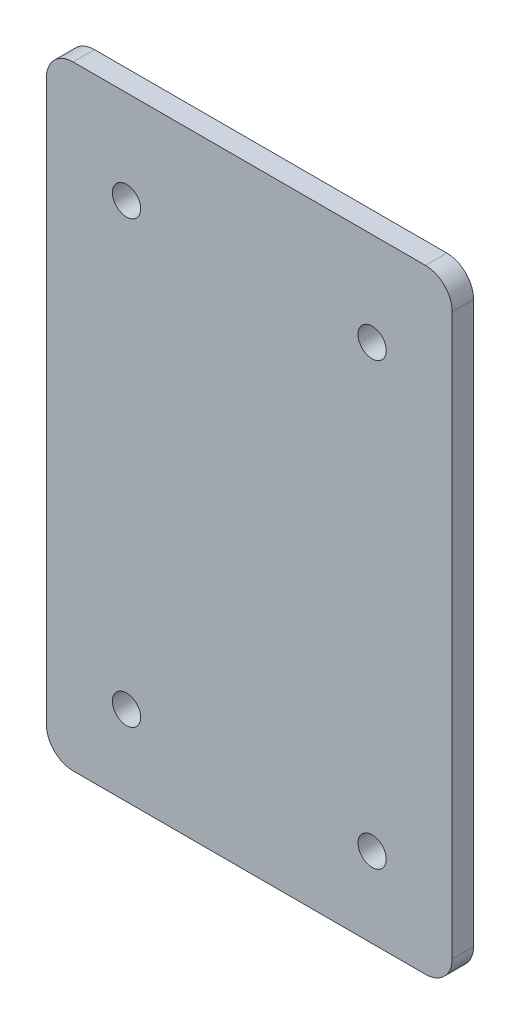
ISO-10303-21;
HEADER;
FILE_DESCRIPTION(('STEP AP214'),'2;1');
FILE_NAME('part.step','',(''),(''),'','','');
FILE_SCHEMA(('AUTOMOTIVE_DESIGN { 1 0 10303 214 1 1 1 1 }'));
ENDSEC;
DATA;
#1=APPLICATION_CONTEXT('core data for automotive mechanical design processes');
#2=APPLICATION_PROTOCOL_DEFINITION('international standard','automotive_design',2000,#1);
#3=PRODUCT_CONTEXT('',#1,'mechanical');
#4=PRODUCT('Part','Part','',(#3));
#5=PRODUCT_RELATED_PRODUCT_CATEGORY('part','',(#4));
#6=PRODUCT_DEFINITION_FORMATION('','',#4);
#7=PRODUCT_DEFINITION_CONTEXT('part definition',#1,'design');
#8=PRODUCT_DEFINITION('design','',#6,#7);
#9=PRODUCT_DEFINITION_SHAPE('','',#8);
#10=(LENGTH_UNIT() NAMED_UNIT(*) SI_UNIT(.MILLI.,.METRE.));
#11=(NAMED_UNIT(*) PLANE_ANGLE_UNIT() SI_UNIT($,.RADIAN.));
#12=(NAMED_UNIT(*) SI_UNIT($,.STERADIAN.) SOLID_ANGLE_UNIT());
#13=UNCERTAINTY_MEASURE_WITH_UNIT(LENGTH_MEASURE(1.E-05),#10,'distance_accuracy_value','');
#14=(GEOMETRIC_REPRESENTATION_CONTEXT(3) GLOBAL_UNCERTAINTY_ASSIGNED_CONTEXT((#13)) GLOBAL_UNIT_ASSIGNED_CONTEXT((#10,
#11,#12)) REPRESENTATION_CONTEXT('',''));
#15=CARTESIAN_POINT('',(0.,0.,0.));
#16=DIRECTION('',(0.,0.,1.));
#17=DIRECTION('',(1.,0.,0.));
#18=AXIS2_PLACEMENT_3D('',#15,#16,#17);
#19=CARTESIAN_POINT('',(-38.,85.,4.));
#20=DIRECTION('',(1.,0.,0.));
#21=DIRECTION('',(0.,1.,0.));
#22=AXIS2_PLACEMENT_3D('',#19,#20,#21);
#23=PLANE('',#22);
#24=DIRECTION('',(0.,-1.,0.));
#25=VECTOR('',#24,1.);
#26=CARTESIAN_POINT('',(-38.,85.,0.));
#27=LINE('',#26,#25);
#28=CARTESIAN_POINT('',(-38.,80.,0.));
#29=VERTEX_POINT('',#28);
#30=CARTESIAN_POINT('',(-38.,-25.,0.));
#31=VERTEX_POINT('',#30);
#32=EDGE_CURVE('E157',#29,#31,#27,.T.);
#33=ORIENTED_EDGE('',*,*,#32,.T.);
#34=DIRECTION('',(0.,0.,-1.));
#35=VECTOR('',#34,1.);
#36=CARTESIAN_POINT('',(-38.,-25.,4.));
#37=LINE('',#36,#35);
#38=CARTESIAN_POINT('',(-38.,-25.,4.));
#39=VERTEX_POINT('',#38);
#40=EDGE_CURVE('E11',#31,#39,#37,.F.);
#41=ORIENTED_EDGE('',*,*,#40,.T.);
#42=DIRECTION('',(0.,-1.,0.));
#43=VECTOR('',#42,1.);
#44=CARTESIAN_POINT('',(-38.,85.,4.));
#45=LINE('',#44,#43);
#46=CARTESIAN_POINT('',(-38.,80.,4.));
#47=VERTEX_POINT('',#46);
#48=EDGE_CURVE('E125',#47,#39,#45,.T.);
#49=ORIENTED_EDGE('',*,*,#48,.F.);
#50=DIRECTION('',(0.,0.,-1.));
#51=VECTOR('',#50,1.);
#52=CARTESIAN_POINT('',(-38.,80.,4.));
#53=LINE('',#52,#51);
#54=EDGE_CURVE('E41',#47,#29,#53,.T.);
#55=ORIENTED_EDGE('',*,*,#54,.T.);
#56=EDGE_LOOP('',(#33,#41,#49,#55));
#57=FACE_BOUND('',#56,.T.);
#58=ADVANCED_FACE('F33',(#57),#23,.F.);
#59=CARTESIAN_POINT('',(-38.,-30.,4.));
#60=DIRECTION('',(0.,1.,0.));
#61=DIRECTION('',(0.,0.,1.));
#62=AXIS2_PLACEMENT_3D('',#59,#60,#61);
#63=PLANE('',#62);
#64=DIRECTION('',(1.,0.,0.));
#65=VECTOR('',#64,1.);
#66=CARTESIAN_POINT('',(-38.,-30.,0.));
#67=LINE('',#66,#65);
#68=CARTESIAN_POINT('',(-33.,-30.,0.));
#69=VERTEX_POINT('',#68);
#70=CARTESIAN_POINT('',(33.,-30.,0.));
#71=VERTEX_POINT('',#70);
#72=EDGE_CURVE('E130',#69,#71,#67,.T.);
#73=ORIENTED_EDGE('',*,*,#72,.T.);
#74=DIRECTION('',(0.,0.,-1.));
#75=VECTOR('',#74,1.);
#76=CARTESIAN_POINT('',(33.,-30.,4.));
#77=LINE('',#76,#75);
#78=CARTESIAN_POINT('',(33.,-30.,4.));
#79=VERTEX_POINT('',#78);
#80=EDGE_CURVE('E48',#71,#79,#77,.F.);
#81=ORIENTED_EDGE('',*,*,#80,.T.);
#82=DIRECTION('',(1.,0.,0.));
#83=VECTOR('',#82,1.);
#84=CARTESIAN_POINT('',(-38.,-30.,4.));
#85=LINE('',#84,#83);
#86=CARTESIAN_POINT('',(-33.,-30.,4.));
#87=VERTEX_POINT('',#86);
#88=EDGE_CURVE('E128',#87,#79,#85,.T.);
#89=ORIENTED_EDGE('',*,*,#88,.F.);
#90=DIRECTION('',(0.,0.,-1.));
#91=VECTOR('',#90,1.);
#92=CARTESIAN_POINT('',(-33.,-30.,4.));
#93=LINE('',#92,#91);
#94=EDGE_CURVE('E149',#87,#69,#93,.T.);
#95=ORIENTED_EDGE('',*,*,#94,.T.);
#96=EDGE_LOOP('',(#73,#81,#89,#95));
#97=FACE_BOUND('',#96,.T.);
#98=ADVANCED_FACE('F212',(#97),#63,.F.);
#99=CARTESIAN_POINT('',(38.,85.,4.));
#100=DIRECTION('',(-1.,0.,0.));
#101=DIRECTION('',(0.,-1.,0.));
#102=AXIS2_PLACEMENT_3D('',#99,#100,#101);
#103=PLANE('',#102);
#104=DIRECTION('',(0.,1.,0.));
#105=VECTOR('',#104,1.);
#106=CARTESIAN_POINT('',(38.,85.,0.));
#107=LINE('',#106,#105);
#108=CARTESIAN_POINT('',(38.,-25.,0.));
#109=VERTEX_POINT('',#108);
#110=CARTESIAN_POINT('',(38.,80.,0.));
#111=VERTEX_POINT('',#110);
#112=EDGE_CURVE('E126',#109,#111,#107,.T.);
#113=ORIENTED_EDGE('',*,*,#112,.T.);
#114=DIRECTION('',(0.,0.,-1.));
#115=VECTOR('',#114,1.);
#116=CARTESIAN_POINT('',(38.,80.,4.));
#117=LINE('',#116,#115);
#118=CARTESIAN_POINT('',(38.,80.,4.));
#119=VERTEX_POINT('',#118);
#120=EDGE_CURVE('E104',#111,#119,#117,.F.);
#121=ORIENTED_EDGE('',*,*,#120,.T.);
#122=DIRECTION('',(0.,1.,0.));
#123=VECTOR('',#122,1.);
#124=CARTESIAN_POINT('',(38.,85.,4.));
#125=LINE('',#124,#123);
#126=CARTESIAN_POINT('',(38.,-25.,4.));
#127=VERTEX_POINT('',#126);
#128=EDGE_CURVE('E169',#127,#119,#125,.T.);
#129=ORIENTED_EDGE('',*,*,#128,.F.);
#130=DIRECTION('',(0.,0.,-1.));
#131=VECTOR('',#130,1.);
#132=CARTESIAN_POINT('',(38.,-25.,4.));
#133=LINE('',#132,#131);
#134=EDGE_CURVE('E109',#127,#109,#133,.T.);
#135=ORIENTED_EDGE('',*,*,#134,.T.);
#136=EDGE_LOOP('',(#113,#121,#129,#135));
#137=FACE_BOUND('',#136,.T.);
#138=ADVANCED_FACE('F209',(#137),#103,.F.);
#139=CARTESIAN_POINT('',(38.,85.,4.));
#140=DIRECTION('',(0.,-1.,0.));
#141=DIRECTION('',(1.,0.,0.));
#142=AXIS2_PLACEMENT_3D('',#139,#140,#141);
#143=PLANE('',#142);
#144=DIRECTION('',(-1.,0.,0.));
#145=VECTOR('',#144,1.);
#146=CARTESIAN_POINT('',(38.,85.,4.));
#147=LINE('',#146,#145);
#148=CARTESIAN_POINT('',(33.,85.,4.));
#149=VERTEX_POINT('',#148);
#150=CARTESIAN_POINT('',(-33.,85.,4.));
#151=VERTEX_POINT('',#150);
#152=EDGE_CURVE('E119',#149,#151,#147,.T.);
#153=ORIENTED_EDGE('',*,*,#152,.F.);
#154=DIRECTION('',(0.,0.,-1.));
#155=VECTOR('',#154,1.);
#156=CARTESIAN_POINT('',(33.,85.,4.));
#157=LINE('',#156,#155);
#158=CARTESIAN_POINT('',(33.,85.,0.));
#159=VERTEX_POINT('',#158);
#160=EDGE_CURVE('E103',#149,#159,#157,.T.);
#161=ORIENTED_EDGE('',*,*,#160,.T.);
#162=DIRECTION('',(-1.,0.,0.));
#163=VECTOR('',#162,1.);
#164=CARTESIAN_POINT('',(38.,85.,0.));
#165=LINE('',#164,#163);
#166=CARTESIAN_POINT('',(-33.,85.,0.));
#167=VERTEX_POINT('',#166);
#168=EDGE_CURVE('E116',#159,#167,#165,.T.);
#169=ORIENTED_EDGE('',*,*,#168,.T.);
#170=DIRECTION('',(0.,0.,-1.));
#171=VECTOR('',#170,1.);
#172=CARTESIAN_POINT('',(-33.,85.,4.));
#173=LINE('',#172,#171);
#174=EDGE_CURVE('E121',#167,#151,#173,.F.);
#175=ORIENTED_EDGE('',*,*,#174,.T.);
#176=EDGE_LOOP('',(#153,#161,#169,#175));
#177=FACE_BOUND('',#176,.T.);
#178=ADVANCED_FACE('F115',(#177),#143,.F.);
#179=CARTESIAN_POINT('',(0.,0.,4.));
#180=DIRECTION('',(0.,0.,1.));
#181=DIRECTION('',(1.,0.,0.));
#182=AXIS2_PLACEMENT_3D('',#179,#180,#181);
#183=PLANE('',#182);
#184=CARTESIAN_POINT('',(-23.,67.5,4.));
#185=DIRECTION('',(0.,0.,1.));
#186=DIRECTION('',(1.,0.,0.));
#187=AXIS2_PLACEMENT_3D('',#184,#185,#186);
#188=CIRCLE('',#187,2.65);
#189=CARTESIAN_POINT('',(-20.35,67.5,4.));
#190=VERTEX_POINT('',#189);
#191=EDGE_CURVE('E190',#190,#190,#188,.T.);
#192=ORIENTED_EDGE('',*,*,#191,.F.);
#193=EDGE_LOOP('',(#192));
#194=FACE_BOUND('',#193,.T.);
#195=CARTESIAN_POINT('',(-23.,-15.,4.));
#196=DIRECTION('',(0.,0.,1.));
#197=DIRECTION('',(1.,0.,0.));
#198=AXIS2_PLACEMENT_3D('',#195,#196,#197);
#199=CIRCLE('',#198,2.65);
#200=CARTESIAN_POINT('',(-20.35,-15.,4.));
#201=VERTEX_POINT('',#200);
#202=EDGE_CURVE('E184',#201,#201,#199,.T.);
#203=ORIENTED_EDGE('',*,*,#202,.F.);
#204=EDGE_LOOP('',(#203));
#205=FACE_BOUND('',#204,.T.);
#206=CARTESIAN_POINT('',(23.,-15.,4.));
#207=DIRECTION('',(0.,0.,1.));
#208=DIRECTION('',(1.,0.,0.));
#209=AXIS2_PLACEMENT_3D('',#206,#207,#208);
#210=CIRCLE('',#209,2.65);
#211=CARTESIAN_POINT('',(25.65,-15.,4.));
#212=VERTEX_POINT('',#211);
#213=EDGE_CURVE('E178',#212,#212,#210,.T.);
#214=ORIENTED_EDGE('',*,*,#213,.F.);
#215=EDGE_LOOP('',(#214));
#216=FACE_BOUND('',#215,.T.);
#217=CARTESIAN_POINT('',(23.,67.5,4.));
#218=DIRECTION('',(0.,0.,1.));
#219=DIRECTION('',(1.,0.,0.));
#220=AXIS2_PLACEMENT_3D('',#217,#218,#219);
#221=CIRCLE('',#220,2.65);
#222=CARTESIAN_POINT('',(25.65,67.5,4.));
#223=VERTEX_POINT('',#222);
#224=EDGE_CURVE('E165',#223,#223,#221,.T.);
#225=ORIENTED_EDGE('',*,*,#224,.F.);
#226=EDGE_LOOP('',(#225));
#227=FACE_BOUND('',#226,.T.);
#228=ORIENTED_EDGE('',*,*,#128,.T.);
#229=CARTESIAN_POINT('',(33.,80.,4.));
#230=DIRECTION('',(0.,0.,1.));
#231=DIRECTION('',(1.,0.,0.));
#232=AXIS2_PLACEMENT_3D('',#229,#230,#231);
#233=CIRCLE('',#232,5.);
#234=EDGE_CURVE('E147',#119,#149,#233,.T.);
#235=ORIENTED_EDGE('',*,*,#234,.T.);
#236=ORIENTED_EDGE('',*,*,#152,.T.);
#237=CARTESIAN_POINT('',(-33.,80.,4.));
#238=DIRECTION('',(0.,0.,1.));
#239=DIRECTION('',(1.,0.,0.));
#240=AXIS2_PLACEMENT_3D('',#237,#238,#239);
#241=CIRCLE('',#240,5.);
#242=EDGE_CURVE('E142',#151,#47,#241,.T.);
#243=ORIENTED_EDGE('',*,*,#242,.T.);
#244=ORIENTED_EDGE('',*,*,#48,.T.);
#245=CARTESIAN_POINT('',(-33.,-25.,4.));
#246=DIRECTION('',(0.,0.,1.));
#247=DIRECTION('',(1.,0.,0.));
#248=AXIS2_PLACEMENT_3D('',#245,#246,#247);
#249=CIRCLE('',#248,5.);
#250=EDGE_CURVE('E55',#39,#87,#249,.T.);
#251=ORIENTED_EDGE('',*,*,#250,.T.);
#252=ORIENTED_EDGE('',*,*,#88,.T.);
#253=CARTESIAN_POINT('',(33.,-25.,4.));
#254=DIRECTION('',(0.,0.,1.));
#255=DIRECTION('',(1.,0.,0.));
#256=AXIS2_PLACEMENT_3D('',#253,#254,#255);
#257=CIRCLE('',#256,5.);
#258=EDGE_CURVE('E145',#79,#127,#257,.T.);
#259=ORIENTED_EDGE('',*,*,#258,.T.);
#260=EDGE_LOOP('',(#228,#235,#236,#243,#244,#251,#252,#259));
#261=FACE_BOUND('',#260,.T.);
#262=ADVANCED_FACE('F196',(#194,#205,#216,#227,#261),#183,.T.);
#263=CARTESIAN_POINT('',(0.,0.,0.));
#264=DIRECTION('',(0.,0.,1.));
#265=DIRECTION('',(1.,0.,0.));
#266=AXIS2_PLACEMENT_3D('',#263,#264,#265);
#267=PLANE('',#266);
#268=CARTESIAN_POINT('',(-23.,67.5,0.));
#269=DIRECTION('',(0.,0.,1.));
#270=DIRECTION('',(1.,0.,0.));
#271=AXIS2_PLACEMENT_3D('',#268,#269,#270);
#272=CIRCLE('',#271,2.65);
#273=CARTESIAN_POINT('',(-20.35,67.5,0.));
#274=VERTEX_POINT('',#273);
#275=EDGE_CURVE('E187',#274,#274,#272,.T.);
#276=ORIENTED_EDGE('',*,*,#275,.T.);
#277=EDGE_LOOP('',(#276));
#278=FACE_BOUND('',#277,.T.);
#279=CARTESIAN_POINT('',(-23.,-15.,0.));
#280=DIRECTION('',(0.,0.,1.));
#281=DIRECTION('',(1.,0.,0.));
#282=AXIS2_PLACEMENT_3D('',#279,#280,#281);
#283=CIRCLE('',#282,2.65);
#284=CARTESIAN_POINT('',(-20.35,-15.,0.));
#285=VERTEX_POINT('',#284);
#286=EDGE_CURVE('E181',#285,#285,#283,.T.);
#287=ORIENTED_EDGE('',*,*,#286,.T.);
#288=EDGE_LOOP('',(#287));
#289=FACE_BOUND('',#288,.T.);
#290=CARTESIAN_POINT('',(23.,-15.,0.));
#291=DIRECTION('',(0.,0.,1.));
#292=DIRECTION('',(1.,0.,0.));
#293=AXIS2_PLACEMENT_3D('',#290,#291,#292);
#294=CIRCLE('',#293,2.65);
#295=CARTESIAN_POINT('',(25.65,-15.,0.));
#296=VERTEX_POINT('',#295);
#297=EDGE_CURVE('E175',#296,#296,#294,.T.);
#298=ORIENTED_EDGE('',*,*,#297,.T.);
#299=EDGE_LOOP('',(#298));
#300=FACE_BOUND('',#299,.T.);
#301=CARTESIAN_POINT('',(23.,67.5,0.));
#302=DIRECTION('',(0.,0.,1.));
#303=DIRECTION('',(1.,0.,0.));
#304=AXIS2_PLACEMENT_3D('',#301,#302,#303);
#305=CIRCLE('',#304,2.65);
#306=CARTESIAN_POINT('',(25.65,67.5,0.));
#307=VERTEX_POINT('',#306);
#308=EDGE_CURVE('E162',#307,#307,#305,.T.);
#309=ORIENTED_EDGE('',*,*,#308,.T.);
#310=EDGE_LOOP('',(#309));
#311=FACE_BOUND('',#310,.T.);
#312=ORIENTED_EDGE('',*,*,#168,.F.);
#313=CARTESIAN_POINT('',(33.,80.,0.));
#314=DIRECTION('',(0.,0.,1.));
#315=DIRECTION('',(1.,0.,0.));
#316=AXIS2_PLACEMENT_3D('',#313,#314,#315);
#317=CIRCLE('',#316,5.);
#318=EDGE_CURVE('E99',#159,#111,#317,.F.);
#319=ORIENTED_EDGE('',*,*,#318,.T.);
#320=ORIENTED_EDGE('',*,*,#112,.F.);
#321=CARTESIAN_POINT('',(33.,-25.,0.));
#322=DIRECTION('',(0.,0.,1.));
#323=DIRECTION('',(1.,0.,0.));
#324=AXIS2_PLACEMENT_3D('',#321,#322,#323);
#325=CIRCLE('',#324,5.);
#326=EDGE_CURVE('E110',#109,#71,#325,.F.);
#327=ORIENTED_EDGE('',*,*,#326,.T.);
#328=ORIENTED_EDGE('',*,*,#72,.F.);
#329=CARTESIAN_POINT('',(-33.,-25.,0.));
#330=DIRECTION('',(0.,0.,1.));
#331=DIRECTION('',(1.,0.,0.));
#332=AXIS2_PLACEMENT_3D('',#329,#330,#331);
#333=CIRCLE('',#332,5.);
#334=EDGE_CURVE('E136',#69,#31,#333,.F.);
#335=ORIENTED_EDGE('',*,*,#334,.T.);
#336=ORIENTED_EDGE('',*,*,#32,.F.);
#337=CARTESIAN_POINT('',(-33.,80.,0.));
#338=DIRECTION('',(0.,0.,1.));
#339=DIRECTION('',(1.,0.,0.));
#340=AXIS2_PLACEMENT_3D('',#337,#338,#339);
#341=CIRCLE('',#340,5.);
#342=EDGE_CURVE('E120',#29,#167,#341,.F.);
#343=ORIENTED_EDGE('',*,*,#342,.T.);
#344=EDGE_LOOP('',(#312,#319,#320,#327,#328,#335,#336,#343));
#345=FACE_BOUND('',#344,.T.);
#346=ADVANCED_FACE('F123',(#278,#289,#300,#311,#345),#267,.F.);
#347=CARTESIAN_POINT('',(23.,67.5,4.));
#348=DIRECTION('',(0.,0.,1.));
#349=DIRECTION('',(1.,0.,0.));
#350=AXIS2_PLACEMENT_3D('',#347,#348,#349);
#351=CYLINDRICAL_SURFACE('',#350,2.65);
#352=ORIENTED_EDGE('',*,*,#308,.F.);
#353=EDGE_LOOP('',(#352));
#354=FACE_BOUND('',#353,.T.);
#355=ORIENTED_EDGE('',*,*,#224,.T.);
#356=EDGE_LOOP('',(#355));
#357=FACE_BOUND('',#356,.T.);
#358=ADVANCED_FACE('F278',(#354,#357),#351,.F.);
#359=CARTESIAN_POINT('',(23.,-15.,4.));
#360=DIRECTION('',(0.,0.,1.));
#361=DIRECTION('',(1.,0.,0.));
#362=AXIS2_PLACEMENT_3D('',#359,#360,#361);
#363=CYLINDRICAL_SURFACE('',#362,2.65);
#364=ORIENTED_EDGE('',*,*,#297,.F.);
#365=EDGE_LOOP('',(#364));
#366=FACE_BOUND('',#365,.T.);
#367=ORIENTED_EDGE('',*,*,#213,.T.);
#368=EDGE_LOOP('',(#367));
#369=FACE_BOUND('',#368,.T.);
#370=ADVANCED_FACE('F269',(#366,#369),#363,.F.);
#371=CARTESIAN_POINT('',(-23.,-15.,4.));
#372=DIRECTION('',(0.,0.,1.));
#373=DIRECTION('',(1.,0.,0.));
#374=AXIS2_PLACEMENT_3D('',#371,#372,#373);
#375=CYLINDRICAL_SURFACE('',#374,2.65);
#376=ORIENTED_EDGE('',*,*,#286,.F.);
#377=EDGE_LOOP('',(#376));
#378=FACE_BOUND('',#377,.T.);
#379=ORIENTED_EDGE('',*,*,#202,.T.);
#380=EDGE_LOOP('',(#379));
#381=FACE_BOUND('',#380,.T.);
#382=ADVANCED_FACE('F260',(#378,#381),#375,.F.);
#383=CARTESIAN_POINT('',(-23.,67.5,4.));
#384=DIRECTION('',(0.,0.,1.));
#385=DIRECTION('',(1.,0.,0.));
#386=AXIS2_PLACEMENT_3D('',#383,#384,#385);
#387=CYLINDRICAL_SURFACE('',#386,2.65);
#388=ORIENTED_EDGE('',*,*,#275,.F.);
#389=EDGE_LOOP('',(#388));
#390=FACE_BOUND('',#389,.T.);
#391=ORIENTED_EDGE('',*,*,#191,.T.);
#392=EDGE_LOOP('',(#391));
#393=FACE_BOUND('',#392,.T.);
#394=ADVANCED_FACE('F194',(#390,#393),#387,.F.);
#395=CARTESIAN_POINT('',(33.,80.,4.));
#396=DIRECTION('',(0.,0.,-1.));
#397=DIRECTION('',(-1.,0.,0.));
#398=AXIS2_PLACEMENT_3D('',#395,#396,#397);
#399=CYLINDRICAL_SURFACE('',#398,5.);
#400=ORIENTED_EDGE('',*,*,#234,.F.);
#401=ORIENTED_EDGE('',*,*,#120,.F.);
#402=ORIENTED_EDGE('',*,*,#318,.F.);
#403=ORIENTED_EDGE('',*,*,#160,.F.);
#404=EDGE_LOOP('',(#400,#401,#402,#403));
#405=FACE_BOUND('',#404,.T.);
#406=ADVANCED_FACE('F102',(#405),#399,.T.);
#407=CARTESIAN_POINT('',(33.,-25.,4.));
#408=DIRECTION('',(0.,0.,-1.));
#409=DIRECTION('',(-1.,0.,0.));
#410=AXIS2_PLACEMENT_3D('',#407,#408,#409);
#411=CYLINDRICAL_SURFACE('',#410,5.);
#412=ORIENTED_EDGE('',*,*,#258,.F.);
#413=ORIENTED_EDGE('',*,*,#80,.F.);
#414=ORIENTED_EDGE('',*,*,#326,.F.);
#415=ORIENTED_EDGE('',*,*,#134,.F.);
#416=EDGE_LOOP('',(#412,#413,#414,#415));
#417=FACE_BOUND('',#416,.T.);
#418=ADVANCED_FACE('F211',(#417),#411,.T.);
#419=CARTESIAN_POINT('',(-33.,-25.,4.));
#420=DIRECTION('',(0.,0.,-1.));
#421=DIRECTION('',(-1.,0.,0.));
#422=AXIS2_PLACEMENT_3D('',#419,#420,#421);
#423=CYLINDRICAL_SURFACE('',#422,5.);
#424=ORIENTED_EDGE('',*,*,#250,.F.);
#425=ORIENTED_EDGE('',*,*,#40,.F.);
#426=ORIENTED_EDGE('',*,*,#334,.F.);
#427=ORIENTED_EDGE('',*,*,#94,.F.);
#428=EDGE_LOOP('',(#424,#425,#426,#427));
#429=FACE_BOUND('',#428,.T.);
#430=ADVANCED_FACE('F215',(#429),#423,.T.);
#431=CARTESIAN_POINT('',(-33.,80.,4.));
#432=DIRECTION('',(0.,0.,-1.));
#433=DIRECTION('',(-1.,0.,0.));
#434=AXIS2_PLACEMENT_3D('',#431,#432,#433);
#435=CYLINDRICAL_SURFACE('',#434,5.);
#436=ORIENTED_EDGE('',*,*,#242,.F.);
#437=ORIENTED_EDGE('',*,*,#174,.F.);
#438=ORIENTED_EDGE('',*,*,#342,.F.);
#439=ORIENTED_EDGE('',*,*,#54,.F.);
#440=EDGE_LOOP('',(#436,#437,#438,#439));
#441=FACE_BOUND('',#440,.T.);
#442=ADVANCED_FACE('F35',(#441),#435,.T.);
#443=CLOSED_SHELL('',(#58,#98,#138,#178,#262,#346,#358,#370,#382,#394,#406,#418,#430,#442));
#444=MANIFOLD_SOLID_BREP('B2',#443);
#445=ADVANCED_BREP_SHAPE_REPRESENTATION('',(#18,#444),#14);
#446=SHAPE_DEFINITION_REPRESENTATION(#9,#445);
ENDSEC;
END-ISO-10303-21;
